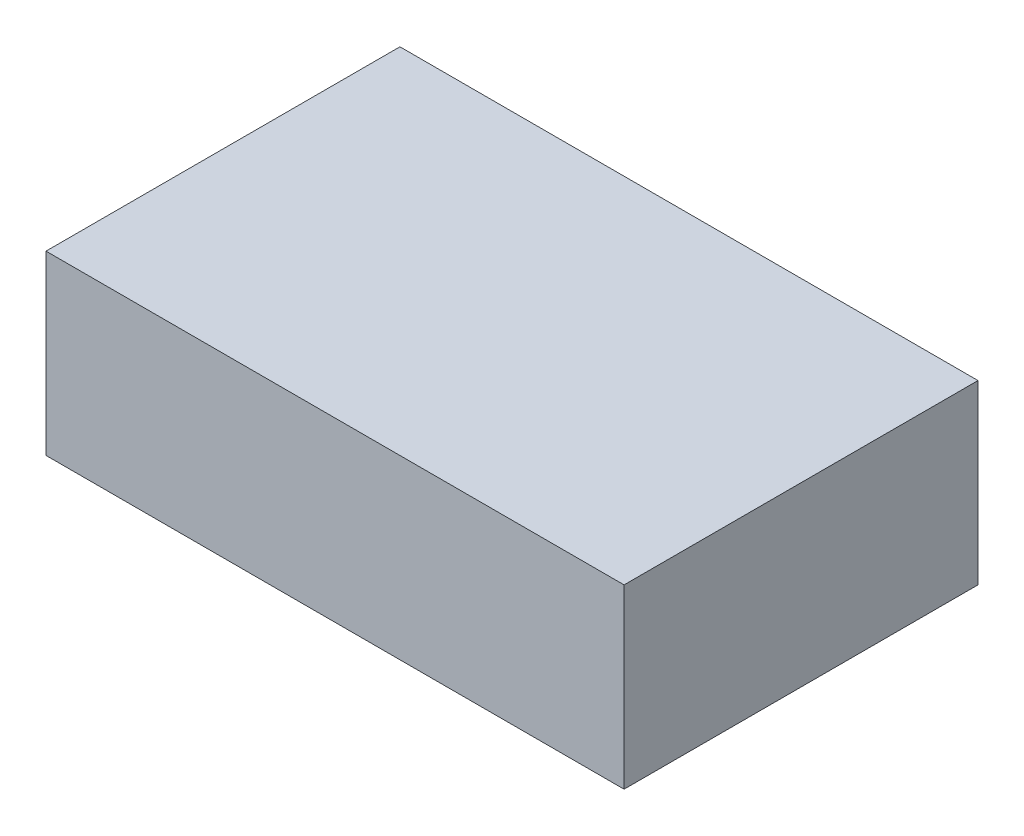
ISO-10303-21;
HEADER;
FILE_DESCRIPTION(('STEP AP214'),'2;1');
FILE_NAME('part.step','',(''),(''),'','','');
FILE_SCHEMA(('AUTOMOTIVE_DESIGN { 1 0 10303 214 1 1 1 1 }'));
ENDSEC;
DATA;
#1=APPLICATION_CONTEXT('core data for automotive mechanical design processes');
#2=APPLICATION_PROTOCOL_DEFINITION('international standard','automotive_design',2000,#1);
#3=PRODUCT_CONTEXT('',#1,'mechanical');
#4=PRODUCT('Part','Part','',(#3));
#5=PRODUCT_RELATED_PRODUCT_CATEGORY('part','',(#4));
#6=PRODUCT_DEFINITION_FORMATION('','',#4);
#7=PRODUCT_DEFINITION_CONTEXT('part definition',#1,'design');
#8=PRODUCT_DEFINITION('design','',#6,#7);
#9=PRODUCT_DEFINITION_SHAPE('','',#8);
#10=(LENGTH_UNIT() NAMED_UNIT(*) SI_UNIT(.MILLI.,.METRE.));
#11=(NAMED_UNIT(*) PLANE_ANGLE_UNIT() SI_UNIT($,.RADIAN.));
#12=(NAMED_UNIT(*) SI_UNIT($,.STERADIAN.) SOLID_ANGLE_UNIT());
#13=UNCERTAINTY_MEASURE_WITH_UNIT(LENGTH_MEASURE(1.E-05),#10,'distance_accuracy_value','');
#14=(GEOMETRIC_REPRESENTATION_CONTEXT(3) GLOBAL_UNCERTAINTY_ASSIGNED_CONTEXT((#13)) GLOBAL_UNIT_ASSIGNED_CONTEXT((#10,
#11,#12)) REPRESENTATION_CONTEXT('',''));
#15=CARTESIAN_POINT('',(0.,0.,0.));
#16=DIRECTION('',(0.,0.,1.));
#17=DIRECTION('',(1.,0.,0.));
#18=AXIS2_PLACEMENT_3D('',#15,#16,#17);
#19=CARTESIAN_POINT('',(49.,30.,30.));
#20=DIRECTION('',(-1.,0.,0.));
#21=DIRECTION('',(0.,0.,1.));
#22=AXIS2_PLACEMENT_3D('',#19,#20,#21);
#23=PLANE('',#22);
#24=DIRECTION('',(0.,0.,-1.));
#25=VECTOR('',#24,1.);
#26=CARTESIAN_POINT('',(49.,0.,30.));
#27=LINE('',#26,#25);
#28=CARTESIAN_POINT('',(49.,0.,30.));
#29=VERTEX_POINT('',#28);
#30=CARTESIAN_POINT('',(49.,0.,-30.));
#31=VERTEX_POINT('',#30);
#32=EDGE_CURVE('E102',#29,#31,#27,.T.);
#33=ORIENTED_EDGE('',*,*,#32,.T.);
#34=DIRECTION('',(0.,-1.,0.));
#35=VECTOR('',#34,1.);
#36=CARTESIAN_POINT('',(49.,30.,-30.));
#37=LINE('',#36,#35);
#38=CARTESIAN_POINT('',(49.,30.,-30.));
#39=VERTEX_POINT('',#38);
#40=EDGE_CURVE('E11',#39,#31,#37,.T.);
#41=ORIENTED_EDGE('',*,*,#40,.F.);
#42=DIRECTION('',(0.,0.,-1.));
#43=VECTOR('',#42,1.);
#44=CARTESIAN_POINT('',(49.,30.,30.));
#45=LINE('',#44,#43);
#46=CARTESIAN_POINT('',(49.,30.,30.));
#47=VERTEX_POINT('',#46);
#48=EDGE_CURVE('E90',#47,#39,#45,.T.);
#49=ORIENTED_EDGE('',*,*,#48,.F.);
#50=DIRECTION('',(0.,-1.,0.));
#51=VECTOR('',#50,1.);
#52=CARTESIAN_POINT('',(49.,30.,30.));
#53=LINE('',#52,#51);
#54=EDGE_CURVE('E98',#47,#29,#53,.T.);
#55=ORIENTED_EDGE('',*,*,#54,.T.);
#56=EDGE_LOOP('',(#33,#41,#49,#55));
#57=FACE_BOUND('',#56,.T.);
#58=ADVANCED_FACE('F39',(#57),#23,.F.);
#59=CARTESIAN_POINT('',(-49.,30.,-30.));
#60=DIRECTION('',(0.,0.,1.));
#61=DIRECTION('',(1.,0.,0.));
#62=AXIS2_PLACEMENT_3D('',#59,#60,#61);
#63=PLANE('',#62);
#64=DIRECTION('',(-1.,0.,0.));
#65=VECTOR('',#64,1.);
#66=CARTESIAN_POINT('',(-49.,0.,-30.));
#67=LINE('',#66,#65);
#68=CARTESIAN_POINT('',(-49.,0.,-30.));
#69=VERTEX_POINT('',#68);
#70=EDGE_CURVE('E94',#31,#69,#67,.T.);
#71=ORIENTED_EDGE('',*,*,#70,.T.);
#72=DIRECTION('',(0.,-1.,0.));
#73=VECTOR('',#72,1.);
#74=CARTESIAN_POINT('',(-49.,30.,-30.));
#75=LINE('',#74,#73);
#76=CARTESIAN_POINT('',(-49.,30.,-30.));
#77=VERTEX_POINT('',#76);
#78=EDGE_CURVE('E47',#77,#69,#75,.T.);
#79=ORIENTED_EDGE('',*,*,#78,.F.);
#80=DIRECTION('',(-1.,0.,0.));
#81=VECTOR('',#80,1.);
#82=CARTESIAN_POINT('',(-49.,30.,-30.));
#83=LINE('',#82,#81);
#84=EDGE_CURVE('E85',#39,#77,#83,.T.);
#85=ORIENTED_EDGE('',*,*,#84,.F.);
#86=ORIENTED_EDGE('',*,*,#40,.T.);
#87=EDGE_LOOP('',(#71,#79,#85,#86));
#88=FACE_BOUND('',#87,.T.);
#89=ADVANCED_FACE('F93',(#88),#63,.F.);
#90=CARTESIAN_POINT('',(-49.,30.,30.));
#91=DIRECTION('',(1.,0.,0.));
#92=DIRECTION('',(0.,0.,-1.));
#93=AXIS2_PLACEMENT_3D('',#90,#91,#92);
#94=PLANE('',#93);
#95=DIRECTION('',(0.,0.,1.));
#96=VECTOR('',#95,1.);
#97=CARTESIAN_POINT('',(-49.,0.,30.));
#98=LINE('',#97,#96);
#99=CARTESIAN_POINT('',(-49.,0.,30.));
#100=VERTEX_POINT('',#99);
#101=EDGE_CURVE('E72',#69,#100,#98,.T.);
#102=ORIENTED_EDGE('',*,*,#101,.T.);
#103=DIRECTION('',(0.,-1.,0.));
#104=VECTOR('',#103,1.);
#105=CARTESIAN_POINT('',(-49.,30.,30.));
#106=LINE('',#105,#104);
#107=CARTESIAN_POINT('',(-49.,30.,30.));
#108=VERTEX_POINT('',#107);
#109=EDGE_CURVE('E95',#108,#100,#106,.T.);
#110=ORIENTED_EDGE('',*,*,#109,.F.);
#111=DIRECTION('',(0.,0.,1.));
#112=VECTOR('',#111,1.);
#113=CARTESIAN_POINT('',(-49.,30.,30.));
#114=LINE('',#113,#112);
#115=EDGE_CURVE('E88',#77,#108,#114,.T.);
#116=ORIENTED_EDGE('',*,*,#115,.F.);
#117=ORIENTED_EDGE('',*,*,#78,.T.);
#118=EDGE_LOOP('',(#102,#110,#116,#117));
#119=FACE_BOUND('',#118,.T.);
#120=ADVANCED_FACE('F96',(#119),#94,.F.);
#121=CARTESIAN_POINT('',(-49.,30.,30.));
#122=DIRECTION('',(0.,0.,-1.));
#123=DIRECTION('',(-1.,0.,0.));
#124=AXIS2_PLACEMENT_3D('',#121,#122,#123);
#125=PLANE('',#124);
#126=DIRECTION('',(1.,0.,0.));
#127=VECTOR('',#126,1.);
#128=CARTESIAN_POINT('',(-49.,0.,30.));
#129=LINE('',#128,#127);
#130=EDGE_CURVE('E78',#100,#29,#129,.T.);
#131=ORIENTED_EDGE('',*,*,#130,.T.);
#132=ORIENTED_EDGE('',*,*,#54,.F.);
#133=DIRECTION('',(1.,0.,0.));
#134=VECTOR('',#133,1.);
#135=CARTESIAN_POINT('',(-49.,30.,30.));
#136=LINE('',#135,#134);
#137=EDGE_CURVE('E55',#108,#47,#136,.T.);
#138=ORIENTED_EDGE('',*,*,#137,.F.);
#139=ORIENTED_EDGE('',*,*,#109,.T.);
#140=EDGE_LOOP('',(#131,#132,#138,#139));
#141=FACE_BOUND('',#140,.T.);
#142=ADVANCED_FACE('F109',(#141),#125,.F.);
#143=CARTESIAN_POINT('',(0.,30.,0.));
#144=DIRECTION('',(0.,-1.,0.));
#145=DIRECTION('',(0.,0.,-1.));
#146=AXIS2_PLACEMENT_3D('',#143,#144,#145);
#147=PLANE('',#146);
#148=ORIENTED_EDGE('',*,*,#48,.T.);
#149=ORIENTED_EDGE('',*,*,#84,.T.);
#150=ORIENTED_EDGE('',*,*,#115,.T.);
#151=ORIENTED_EDGE('',*,*,#137,.T.);
#152=EDGE_LOOP('',(#148,#149,#150,#151));
#153=FACE_BOUND('',#152,.T.);
#154=ADVANCED_FACE('F86',(#153),#147,.F.);
#155=CARTESIAN_POINT('',(0.,0.,0.));
#156=DIRECTION('',(0.,-1.,0.));
#157=DIRECTION('',(0.,0.,-1.));
#158=AXIS2_PLACEMENT_3D('',#155,#156,#157);
#159=PLANE('',#158);
#160=ORIENTED_EDGE('',*,*,#32,.F.);
#161=ORIENTED_EDGE('',*,*,#130,.F.);
#162=ORIENTED_EDGE('',*,*,#101,.F.);
#163=ORIENTED_EDGE('',*,*,#70,.F.);
#164=EDGE_LOOP('',(#160,#161,#162,#163));
#165=FACE_BOUND('',#164,.T.);
#166=ADVANCED_FACE('F112',(#165),#159,.T.);
#167=CLOSED_SHELL('',(#58,#89,#120,#142,#154,#166));
#168=MANIFOLD_SOLID_BREP('B2',#167);
#169=ADVANCED_BREP_SHAPE_REPRESENTATION('',(#18,#168),#14);
#170=SHAPE_DEFINITION_REPRESENTATION(#9,#169);
ENDSEC;
END-ISO-10303-21;
